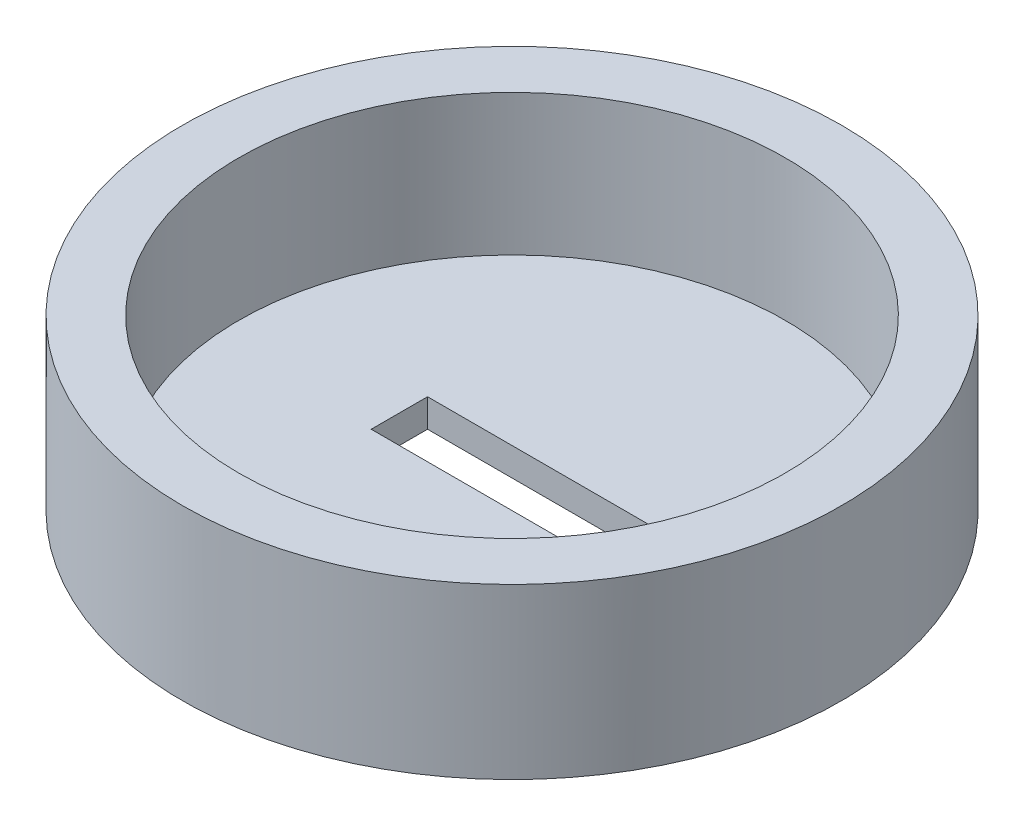
ISO-10303-21;
HEADER;
FILE_DESCRIPTION(('STEP AP214'),'2;1');
FILE_NAME('part.step','',(''),(''),'','','');
FILE_SCHEMA(('AUTOMOTIVE_DESIGN { 1 0 10303 214 1 1 1 1 }'));
ENDSEC;
DATA;
#1=APPLICATION_CONTEXT('core data for automotive mechanical design processes');
#2=APPLICATION_PROTOCOL_DEFINITION('international standard','automotive_design',2000,#1);
#3=PRODUCT_CONTEXT('',#1,'mechanical');
#4=PRODUCT('Part','Part','',(#3));
#5=PRODUCT_RELATED_PRODUCT_CATEGORY('part','',(#4));
#6=PRODUCT_DEFINITION_FORMATION('','',#4);
#7=PRODUCT_DEFINITION_CONTEXT('part definition',#1,'design');
#8=PRODUCT_DEFINITION('design','',#6,#7);
#9=PRODUCT_DEFINITION_SHAPE('','',#8);
#10=(LENGTH_UNIT() NAMED_UNIT(*) SI_UNIT(.MILLI.,.METRE.));
#11=(NAMED_UNIT(*) PLANE_ANGLE_UNIT() SI_UNIT($,.RADIAN.));
#12=(NAMED_UNIT(*) SI_UNIT($,.STERADIAN.) SOLID_ANGLE_UNIT());
#13=UNCERTAINTY_MEASURE_WITH_UNIT(LENGTH_MEASURE(1.E-05),#10,'distance_accuracy_value','');
#14=(GEOMETRIC_REPRESENTATION_CONTEXT(3) GLOBAL_UNCERTAINTY_ASSIGNED_CONTEXT((#13)) GLOBAL_UNIT_ASSIGNED_CONTEXT((#10,
#11,#12)) REPRESENTATION_CONTEXT('',''));
#15=CARTESIAN_POINT('',(0.,0.,0.));
#16=DIRECTION('',(0.,0.,1.));
#17=DIRECTION('',(1.,0.,0.));
#18=AXIS2_PLACEMENT_3D('',#15,#16,#17);
#19=CARTESIAN_POINT('',(0.,5.,0.));
#20=DIRECTION('',(0.,1.,0.));
#21=DIRECTION('',(0.,0.,1.));
#22=AXIS2_PLACEMENT_3D('',#19,#20,#21);
#23=PLANE('',#22);
#24=CARTESIAN_POINT('',(0.,5.,0.));
#25=DIRECTION('',(0.,1.,0.));
#26=DIRECTION('',(0.,0.,1.));
#27=AXIS2_PLACEMENT_3D('',#24,#25,#26);
#28=CIRCLE('',#27,11.7);
#29=CARTESIAN_POINT('',(0.,5.,11.7));
#30=VERTEX_POINT('',#29);
#31=EDGE_CURVE('E11',#30,#30,#28,.T.);
#32=ORIENTED_EDGE('',*,*,#31,.T.);
#33=EDGE_LOOP('',(#32));
#34=FACE_BOUND('',#33,.T.);
#35=CARTESIAN_POINT('',(0.,5.,0.));
#36=DIRECTION('',(0.,1.,0.));
#37=DIRECTION('',(0.,0.,1.));
#38=AXIS2_PLACEMENT_3D('',#35,#36,#37);
#39=CIRCLE('',#38,9.7);
#40=CARTESIAN_POINT('',(0.,5.,9.7));
#41=VERTEX_POINT('',#40);
#42=EDGE_CURVE('E41',#41,#41,#39,.T.);
#43=ORIENTED_EDGE('',*,*,#42,.F.);
#44=EDGE_LOOP('',(#43));
#45=FACE_BOUND('',#44,.T.);
#46=ADVANCED_FACE('F33',(#34,#45),#23,.T.);
#47=CARTESIAN_POINT('',(0.,5.,0.));
#48=DIRECTION('',(0.,-1.,0.));
#49=DIRECTION('',(0.,0.,-1.));
#50=AXIS2_PLACEMENT_3D('',#47,#48,#49);
#51=CYLINDRICAL_SURFACE('',#50,11.7);
#52=ORIENTED_EDGE('',*,*,#31,.F.);
#53=EDGE_LOOP('',(#52));
#54=FACE_BOUND('',#53,.T.);
#55=CARTESIAN_POINT('',(0.,-1.,0.));
#56=DIRECTION('',(0.,-1.,0.));
#57=DIRECTION('',(0.,0.,-1.));
#58=AXIS2_PLACEMENT_3D('',#55,#56,#57);
#59=CIRCLE('',#58,11.7);
#60=CARTESIAN_POINT('',(0.,-1.,-11.7));
#61=VERTEX_POINT('',#60);
#62=EDGE_CURVE('E111',#61,#61,#59,.T.);
#63=ORIENTED_EDGE('',*,*,#62,.F.);
#64=EDGE_LOOP('',(#63));
#65=FACE_BOUND('',#64,.T.);
#66=ADVANCED_FACE('F35',(#54,#65),#51,.T.);
#67=CARTESIAN_POINT('',(0.,5.,0.));
#68=DIRECTION('',(0.,-1.,0.));
#69=DIRECTION('',(0.,0.,-1.));
#70=AXIS2_PLACEMENT_3D('',#67,#68,#69);
#71=CYLINDRICAL_SURFACE('',#70,9.7);
#72=ORIENTED_EDGE('',*,*,#42,.T.);
#73=EDGE_LOOP('',(#72));
#74=FACE_BOUND('',#73,.T.);
#75=CARTESIAN_POINT('',(0.,0.,0.));
#76=DIRECTION('',(0.,1.,0.));
#77=DIRECTION('',(0.,0.,1.));
#78=AXIS2_PLACEMENT_3D('',#75,#76,#77);
#79=CIRCLE('',#78,9.7);
#80=CARTESIAN_POINT('',(0.,0.,9.7));
#81=VERTEX_POINT('',#80);
#82=EDGE_CURVE('E114',#81,#81,#79,.T.);
#83=ORIENTED_EDGE('',*,*,#82,.F.);
#84=EDGE_LOOP('',(#83));
#85=FACE_BOUND('',#84,.T.);
#86=ADVANCED_FACE('F121',(#74,#85),#71,.F.);
#87=CARTESIAN_POINT('',(0.,0.,0.));
#88=DIRECTION('',(0.,-1.,0.));
#89=DIRECTION('',(0.,0.,-1.));
#90=AXIS2_PLACEMENT_3D('',#87,#88,#89);
#91=PLANE('',#90);
#92=DIRECTION('',(1.,0.,0.));
#93=VECTOR('',#92,1.);
#94=CARTESIAN_POINT('',(0.,0.,-1.));
#95=LINE('',#94,#93);
#96=CARTESIAN_POINT('',(-4.,0.,-1.));
#97=VERTEX_POINT('',#96);
#98=CARTESIAN_POINT('',(4.,0.,-1.));
#99=VERTEX_POINT('',#98);
#100=EDGE_CURVE('E105',#97,#99,#95,.T.);
#101=ORIENTED_EDGE('',*,*,#100,.T.);
#102=DIRECTION('',(0.,0.,1.));
#103=VECTOR('',#102,1.);
#104=CARTESIAN_POINT('',(4.,0.,0.));
#105=LINE('',#104,#103);
#106=CARTESIAN_POINT('',(4.,0.,1.));
#107=VERTEX_POINT('',#106);
#108=EDGE_CURVE('E108',#99,#107,#105,.T.);
#109=ORIENTED_EDGE('',*,*,#108,.T.);
#110=DIRECTION('',(-1.,0.,0.));
#111=VECTOR('',#110,1.);
#112=CARTESIAN_POINT('',(0.,0.,1.));
#113=LINE('',#112,#111);
#114=CARTESIAN_POINT('',(-4.,0.,1.));
#115=VERTEX_POINT('',#114);
#116=EDGE_CURVE('E100',#107,#115,#113,.T.);
#117=ORIENTED_EDGE('',*,*,#116,.T.);
#118=DIRECTION('',(0.,0.,-1.));
#119=VECTOR('',#118,1.);
#120=CARTESIAN_POINT('',(-4.,0.,0.));
#121=LINE('',#120,#119);
#122=EDGE_CURVE('E80',#115,#97,#121,.T.);
#123=ORIENTED_EDGE('',*,*,#122,.T.);
#124=EDGE_LOOP('',(#101,#109,#117,#123));
#125=FACE_BOUND('',#124,.T.);
#126=ORIENTED_EDGE('',*,*,#82,.T.);
#127=EDGE_LOOP('',(#126));
#128=FACE_BOUND('',#127,.T.);
#129=ADVANCED_FACE('F119',(#125,#128),#91,.F.);
#130=CARTESIAN_POINT('',(0.,-1.,0.));
#131=DIRECTION('',(0.,-1.,0.));
#132=DIRECTION('',(0.,0.,-1.));
#133=AXIS2_PLACEMENT_3D('',#130,#131,#132);
#134=PLANE('',#133);
#135=DIRECTION('',(0.,0.,1.));
#136=VECTOR('',#135,1.);
#137=CARTESIAN_POINT('',(4.,-1.,1.));
#138=LINE('',#137,#136);
#139=CARTESIAN_POINT('',(4.,-1.,-1.));
#140=VERTEX_POINT('',#139);
#141=CARTESIAN_POINT('',(4.,-1.,1.));
#142=VERTEX_POINT('',#141);
#143=EDGE_CURVE('E56',#140,#142,#138,.T.);
#144=ORIENTED_EDGE('',*,*,#143,.F.);
#145=DIRECTION('',(1.,0.,0.));
#146=VECTOR('',#145,1.);
#147=CARTESIAN_POINT('',(-4.,-1.,-1.));
#148=LINE('',#147,#146);
#149=CARTESIAN_POINT('',(-4.,-1.,-1.));
#150=VERTEX_POINT('',#149);
#151=EDGE_CURVE('E93',#150,#140,#148,.T.);
#152=ORIENTED_EDGE('',*,*,#151,.F.);
#153=DIRECTION('',(0.,0.,-1.));
#154=VECTOR('',#153,1.);
#155=CARTESIAN_POINT('',(-4.,-1.,1.));
#156=LINE('',#155,#154);
#157=CARTESIAN_POINT('',(-4.,-1.,1.));
#158=VERTEX_POINT('',#157);
#159=EDGE_CURVE('E77',#158,#150,#156,.T.);
#160=ORIENTED_EDGE('',*,*,#159,.F.);
#161=DIRECTION('',(-1.,0.,0.));
#162=VECTOR('',#161,1.);
#163=CARTESIAN_POINT('',(-4.,-1.,1.));
#164=LINE('',#163,#162);
#165=EDGE_CURVE('E86',#142,#158,#164,.T.);
#166=ORIENTED_EDGE('',*,*,#165,.F.);
#167=EDGE_LOOP('',(#144,#152,#160,#166));
#168=FACE_BOUND('',#167,.T.);
#169=ORIENTED_EDGE('',*,*,#62,.T.);
#170=EDGE_LOOP('',(#169));
#171=FACE_BOUND('',#170,.T.);
#172=ADVANCED_FACE('F90',(#168,#171),#134,.T.);
#173=CARTESIAN_POINT('',(4.,6.,1.));
#174=DIRECTION('',(1.,0.,0.));
#175=DIRECTION('',(0.,0.,-1.));
#176=AXIS2_PLACEMENT_3D('',#173,#174,#175);
#177=PLANE('',#176);
#178=DIRECTION('',(0.,-1.,0.));
#179=VECTOR('',#178,1.);
#180=CARTESIAN_POINT('',(4.,6.,-1.));
#181=LINE('',#180,#179);
#182=EDGE_CURVE('E98',#99,#140,#181,.T.);
#183=ORIENTED_EDGE('',*,*,#182,.T.);
#184=ORIENTED_EDGE('',*,*,#143,.T.);
#185=DIRECTION('',(0.,-1.,0.));
#186=VECTOR('',#185,1.);
#187=CARTESIAN_POINT('',(4.,6.,1.));
#188=LINE('',#187,#186);
#189=EDGE_CURVE('E83',#107,#142,#188,.T.);
#190=ORIENTED_EDGE('',*,*,#189,.F.);
#191=ORIENTED_EDGE('',*,*,#108,.F.);
#192=EDGE_LOOP('',(#183,#184,#190,#191));
#193=FACE_BOUND('',#192,.T.);
#194=ADVANCED_FACE('F142',(#193),#177,.F.);
#195=CARTESIAN_POINT('',(-4.,6.,-1.));
#196=DIRECTION('',(0.,0.,-1.));
#197=DIRECTION('',(-1.,0.,0.));
#198=AXIS2_PLACEMENT_3D('',#195,#196,#197);
#199=PLANE('',#198);
#200=DIRECTION('',(0.,-1.,0.));
#201=VECTOR('',#200,1.);
#202=CARTESIAN_POINT('',(-4.,6.,-1.));
#203=LINE('',#202,#201);
#204=EDGE_CURVE('E82',#97,#150,#203,.T.);
#205=ORIENTED_EDGE('',*,*,#204,.T.);
#206=ORIENTED_EDGE('',*,*,#151,.T.);
#207=ORIENTED_EDGE('',*,*,#182,.F.);
#208=ORIENTED_EDGE('',*,*,#100,.F.);
#209=EDGE_LOOP('',(#205,#206,#207,#208));
#210=FACE_BOUND('',#209,.T.);
#211=ADVANCED_FACE('F147',(#210),#199,.F.);
#212=CARTESIAN_POINT('',(-4.,6.,1.));
#213=DIRECTION('',(-1.,0.,0.));
#214=DIRECTION('',(0.,0.,1.));
#215=AXIS2_PLACEMENT_3D('',#212,#213,#214);
#216=PLANE('',#215);
#217=DIRECTION('',(0.,-1.,0.));
#218=VECTOR('',#217,1.);
#219=CARTESIAN_POINT('',(-4.,6.,1.));
#220=LINE('',#219,#218);
#221=EDGE_CURVE('E48',#115,#158,#220,.T.);
#222=ORIENTED_EDGE('',*,*,#221,.T.);
#223=ORIENTED_EDGE('',*,*,#159,.T.);
#224=ORIENTED_EDGE('',*,*,#204,.F.);
#225=ORIENTED_EDGE('',*,*,#122,.F.);
#226=EDGE_LOOP('',(#222,#223,#224,#225));
#227=FACE_BOUND('',#226,.T.);
#228=ADVANCED_FACE('F74',(#227),#216,.F.);
#229=CARTESIAN_POINT('',(-4.,6.,1.));
#230=DIRECTION('',(0.,0.,1.));
#231=DIRECTION('',(1.,0.,0.));
#232=AXIS2_PLACEMENT_3D('',#229,#230,#231);
#233=PLANE('',#232);
#234=ORIENTED_EDGE('',*,*,#189,.T.);
#235=ORIENTED_EDGE('',*,*,#165,.T.);
#236=ORIENTED_EDGE('',*,*,#221,.F.);
#237=ORIENTED_EDGE('',*,*,#116,.F.);
#238=EDGE_LOOP('',(#234,#235,#236,#237));
#239=FACE_BOUND('',#238,.T.);
#240=ADVANCED_FACE('F87',(#239),#233,.F.);
#241=CLOSED_SHELL('',(#46,#66,#86,#129,#172,#194,#211,#228,#240));
#242=MANIFOLD_SOLID_BREP('B2',#241);
#243=ADVANCED_BREP_SHAPE_REPRESENTATION('',(#18,#242),#14);
#244=SHAPE_DEFINITION_REPRESENTATION(#9,#243);
ENDSEC;
END-ISO-10303-21;
